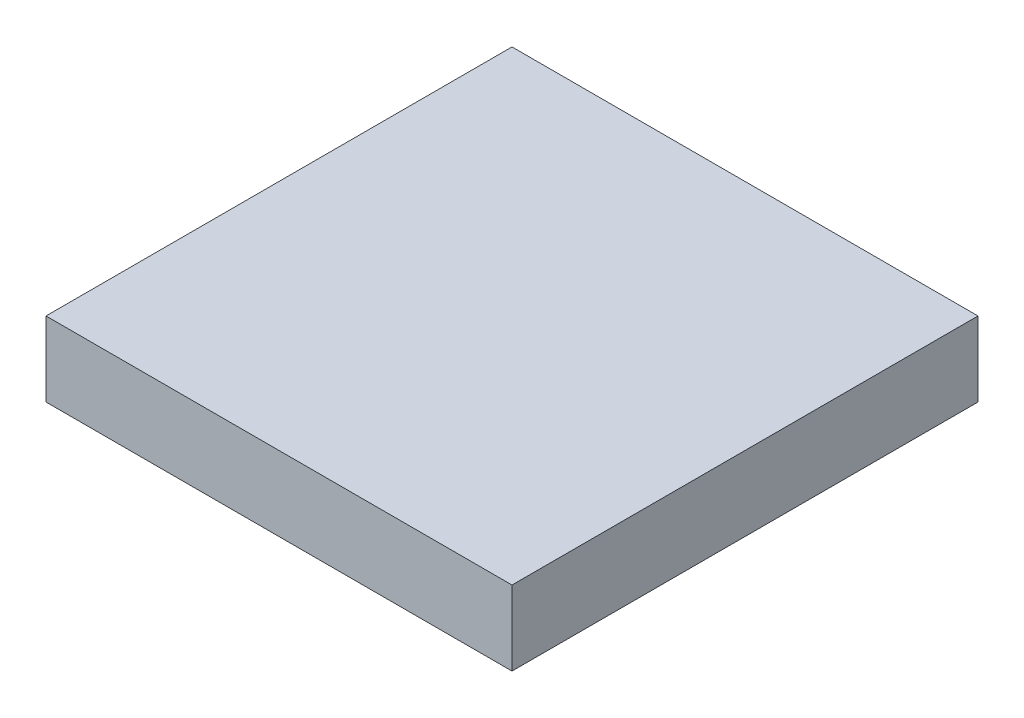
ISO-10303-21;
HEADER;
FILE_DESCRIPTION(('STEP AP214'),'2;1');
FILE_NAME('part.step','',(''),(''),'','','');
FILE_SCHEMA(('AUTOMOTIVE_DESIGN { 1 0 10303 214 1 1 1 1 }'));
ENDSEC;
DATA;
#1=APPLICATION_CONTEXT('core data for automotive mechanical design processes');
#2=APPLICATION_PROTOCOL_DEFINITION('international standard','automotive_design',2000,#1);
#3=PRODUCT_CONTEXT('',#1,'mechanical');
#4=PRODUCT('Part','Part','',(#3));
#5=PRODUCT_RELATED_PRODUCT_CATEGORY('part','',(#4));
#6=PRODUCT_DEFINITION_FORMATION('','',#4);
#7=PRODUCT_DEFINITION_CONTEXT('part definition',#1,'design');
#8=PRODUCT_DEFINITION('design','',#6,#7);
#9=PRODUCT_DEFINITION_SHAPE('','',#8);
#10=(LENGTH_UNIT() NAMED_UNIT(*) SI_UNIT(.MILLI.,.METRE.));
#11=(NAMED_UNIT(*) PLANE_ANGLE_UNIT() SI_UNIT($,.RADIAN.));
#12=(NAMED_UNIT(*) SI_UNIT($,.STERADIAN.) SOLID_ANGLE_UNIT());
#13=UNCERTAINTY_MEASURE_WITH_UNIT(LENGTH_MEASURE(1.E-05),#10,'distance_accuracy_value','');
#14=(GEOMETRIC_REPRESENTATION_CONTEXT(3) GLOBAL_UNCERTAINTY_ASSIGNED_CONTEXT((#13)) GLOBAL_UNIT_ASSIGNED_CONTEXT((#10,
#11,#12)) REPRESENTATION_CONTEXT('',''));
#15=CARTESIAN_POINT('',(0.,0.,0.));
#16=DIRECTION('',(0.,0.,1.));
#17=DIRECTION('',(1.,0.,0.));
#18=AXIS2_PLACEMENT_3D('',#15,#16,#17);
#19=CARTESIAN_POINT('',(0.,0.,-50.));
#20=DIRECTION('',(-1.,0.,0.));
#21=DIRECTION('',(0.,0.,1.));
#22=AXIS2_PLACEMENT_3D('',#19,#20,#21);
#23=PLANE('',#22);
#24=DIRECTION('',(0.,-1.,0.));
#25=VECTOR('',#24,1.);
#26=CARTESIAN_POINT('',(0.,0.,0.));
#27=LINE('',#26,#25);
#28=CARTESIAN_POINT('',(0.,8.,0.));
#29=VERTEX_POINT('',#28);
#30=CARTESIAN_POINT('',(0.,0.,0.));
#31=VERTEX_POINT('',#30);
#32=EDGE_CURVE('E101',#29,#31,#27,.T.);
#33=ORIENTED_EDGE('',*,*,#32,.F.);
#34=DIRECTION('',(0.,0.,1.));
#35=VECTOR('',#34,1.);
#36=CARTESIAN_POINT('',(0.,8.,-50.));
#37=LINE('',#36,#35);
#38=CARTESIAN_POINT('',(0.,8.,-50.));
#39=VERTEX_POINT('',#38);
#40=EDGE_CURVE('E11',#39,#29,#37,.T.);
#41=ORIENTED_EDGE('',*,*,#40,.F.);
#42=DIRECTION('',(0.,-1.,0.));
#43=VECTOR('',#42,1.);
#44=CARTESIAN_POINT('',(0.,0.,-50.));
#45=LINE('',#44,#43);
#46=CARTESIAN_POINT('',(0.,0.,-50.));
#47=VERTEX_POINT('',#46);
#48=EDGE_CURVE('E95',#39,#47,#45,.T.);
#49=ORIENTED_EDGE('',*,*,#48,.T.);
#50=DIRECTION('',(0.,0.,1.));
#51=VECTOR('',#50,1.);
#52=CARTESIAN_POINT('',(0.,0.,-50.));
#53=LINE('',#52,#51);
#54=EDGE_CURVE('E40',#47,#31,#53,.T.);
#55=ORIENTED_EDGE('',*,*,#54,.T.);
#56=EDGE_LOOP('',(#33,#41,#49,#55));
#57=FACE_BOUND('',#56,.T.);
#58=ADVANCED_FACE('F37',(#57),#23,.T.);
#59=CARTESIAN_POINT('',(0.,8.,-50.));
#60=DIRECTION('',(0.,1.,0.));
#61=DIRECTION('',(-1.,0.,0.));
#62=AXIS2_PLACEMENT_3D('',#59,#60,#61);
#63=PLANE('',#62);
#64=DIRECTION('',(-1.,0.,0.));
#65=VECTOR('',#64,1.);
#66=CARTESIAN_POINT('',(0.,8.,0.));
#67=LINE('',#66,#65);
#68=CARTESIAN_POINT('',(50.,8.,0.));
#69=VERTEX_POINT('',#68);
#70=EDGE_CURVE('E97',#69,#29,#67,.T.);
#71=ORIENTED_EDGE('',*,*,#70,.F.);
#72=DIRECTION('',(0.,0.,1.));
#73=VECTOR('',#72,1.);
#74=CARTESIAN_POINT('',(50.,8.,-50.));
#75=LINE('',#74,#73);
#76=CARTESIAN_POINT('',(50.,8.,-50.));
#77=VERTEX_POINT('',#76);
#78=EDGE_CURVE('E46',#77,#69,#75,.T.);
#79=ORIENTED_EDGE('',*,*,#78,.F.);
#80=DIRECTION('',(-1.,0.,0.));
#81=VECTOR('',#80,1.);
#82=CARTESIAN_POINT('',(0.,8.,-50.));
#83=LINE('',#82,#81);
#84=EDGE_CURVE('E92',#77,#39,#83,.T.);
#85=ORIENTED_EDGE('',*,*,#84,.T.);
#86=ORIENTED_EDGE('',*,*,#40,.T.);
#87=EDGE_LOOP('',(#71,#79,#85,#86));
#88=FACE_BOUND('',#87,.T.);
#89=ADVANCED_FACE('F111',(#88),#63,.T.);
#90=CARTESIAN_POINT('',(50.,0.,-50.));
#91=DIRECTION('',(1.,0.,0.));
#92=DIRECTION('',(0.,0.,-1.));
#93=AXIS2_PLACEMENT_3D('',#90,#91,#92);
#94=PLANE('',#93);
#95=DIRECTION('',(0.,1.,0.));
#96=VECTOR('',#95,1.);
#97=CARTESIAN_POINT('',(50.,0.,0.));
#98=LINE('',#97,#96);
#99=CARTESIAN_POINT('',(50.,0.,0.));
#100=VERTEX_POINT('',#99);
#101=EDGE_CURVE('E87',#100,#69,#98,.T.);
#102=ORIENTED_EDGE('',*,*,#101,.F.);
#103=DIRECTION('',(0.,0.,1.));
#104=VECTOR('',#103,1.);
#105=CARTESIAN_POINT('',(50.,0.,-50.));
#106=LINE('',#105,#104);
#107=CARTESIAN_POINT('',(50.,0.,-50.));
#108=VERTEX_POINT('',#107);
#109=EDGE_CURVE('E82',#108,#100,#106,.T.);
#110=ORIENTED_EDGE('',*,*,#109,.F.);
#111=DIRECTION('',(0.,1.,0.));
#112=VECTOR('',#111,1.);
#113=CARTESIAN_POINT('',(50.,0.,-50.));
#114=LINE('',#113,#112);
#115=EDGE_CURVE('E85',#108,#77,#114,.T.);
#116=ORIENTED_EDGE('',*,*,#115,.T.);
#117=ORIENTED_EDGE('',*,*,#78,.T.);
#118=EDGE_LOOP('',(#102,#110,#116,#117));
#119=FACE_BOUND('',#118,.T.);
#120=ADVANCED_FACE('F84',(#119),#94,.T.);
#121=CARTESIAN_POINT('',(0.,0.,-50.));
#122=DIRECTION('',(0.,-1.,0.));
#123=DIRECTION('',(1.,0.,0.));
#124=AXIS2_PLACEMENT_3D('',#121,#122,#123);
#125=PLANE('',#124);
#126=DIRECTION('',(1.,0.,0.));
#127=VECTOR('',#126,1.);
#128=CARTESIAN_POINT('',(0.,0.,0.));
#129=LINE('',#128,#127);
#130=EDGE_CURVE('E104',#31,#100,#129,.T.);
#131=ORIENTED_EDGE('',*,*,#130,.F.);
#132=ORIENTED_EDGE('',*,*,#54,.F.);
#133=DIRECTION('',(1.,0.,0.));
#134=VECTOR('',#133,1.);
#135=CARTESIAN_POINT('',(0.,0.,-50.));
#136=LINE('',#135,#134);
#137=EDGE_CURVE('E91',#47,#108,#136,.T.);
#138=ORIENTED_EDGE('',*,*,#137,.T.);
#139=ORIENTED_EDGE('',*,*,#109,.T.);
#140=EDGE_LOOP('',(#131,#132,#138,#139));
#141=FACE_BOUND('',#140,.T.);
#142=ADVANCED_FACE('F94',(#141),#125,.T.);
#143=CARTESIAN_POINT('',(0.,8.,-50.));
#144=DIRECTION('',(0.,0.,-1.));
#145=DIRECTION('',(-1.,0.,0.));
#146=AXIS2_PLACEMENT_3D('',#143,#144,#145);
#147=PLANE('',#146);
#148=ORIENTED_EDGE('',*,*,#48,.F.);
#149=ORIENTED_EDGE('',*,*,#84,.F.);
#150=ORIENTED_EDGE('',*,*,#115,.F.);
#151=ORIENTED_EDGE('',*,*,#137,.F.);
#152=EDGE_LOOP('',(#148,#149,#150,#151));
#153=FACE_BOUND('',#152,.T.);
#154=ADVANCED_FACE('F90',(#153),#147,.T.);
#155=CARTESIAN_POINT('',(0.,8.,0.));
#156=DIRECTION('',(0.,0.,-1.));
#157=DIRECTION('',(-1.,0.,0.));
#158=AXIS2_PLACEMENT_3D('',#155,#156,#157);
#159=PLANE('',#158);
#160=ORIENTED_EDGE('',*,*,#32,.T.);
#161=ORIENTED_EDGE('',*,*,#130,.T.);
#162=ORIENTED_EDGE('',*,*,#101,.T.);
#163=ORIENTED_EDGE('',*,*,#70,.T.);
#164=EDGE_LOOP('',(#160,#161,#162,#163));
#165=FACE_BOUND('',#164,.T.);
#166=ADVANCED_FACE('F110',(#165),#159,.F.);
#167=CLOSED_SHELL('',(#58,#89,#120,#142,#154,#166));
#168=MANIFOLD_SOLID_BREP('B2',#167);
#169=ADVANCED_BREP_SHAPE_REPRESENTATION('',(#18,#168),#14);
#170=SHAPE_DEFINITION_REPRESENTATION(#9,#169);
ENDSEC;
END-ISO-10303-21;
